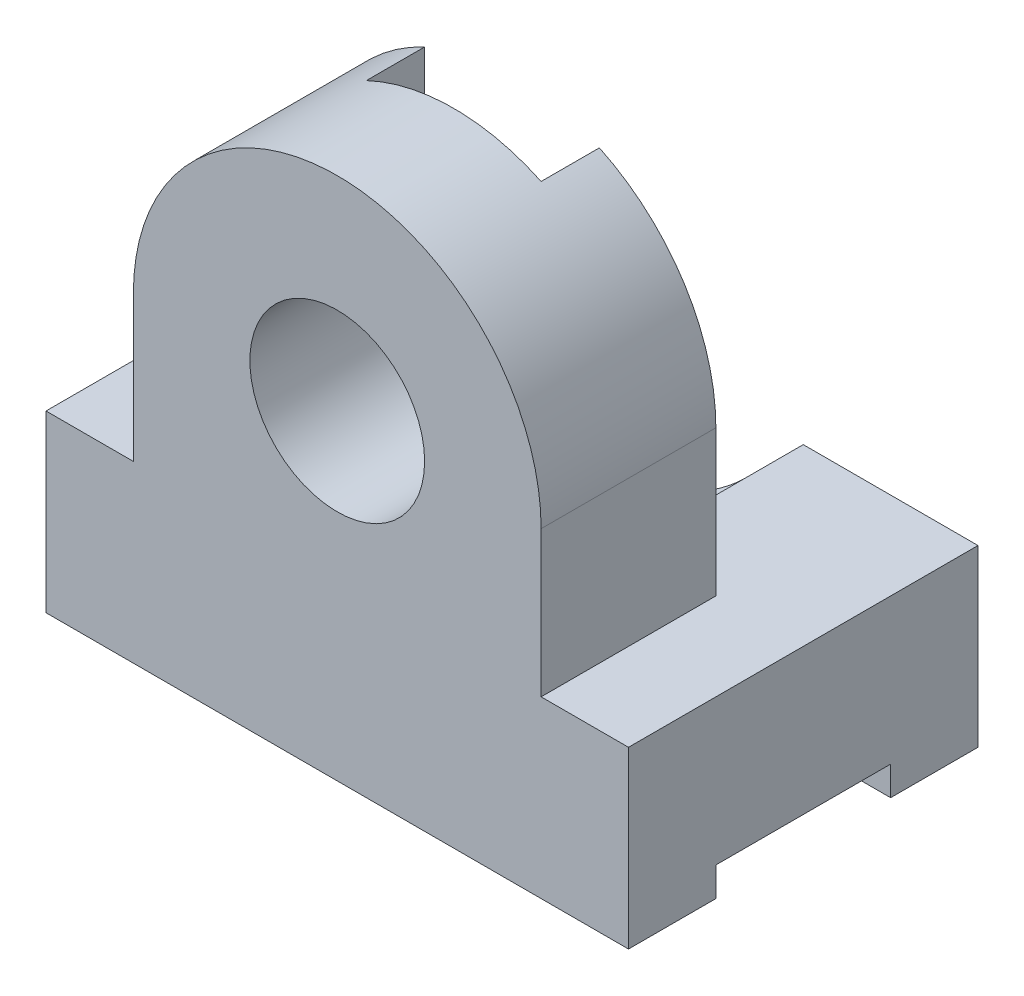
ISO-10303-21;
HEADER;
FILE_DESCRIPTION(('STEP AP214'),'2;1');
FILE_NAME('part.step','',(''),(''),'','','');
FILE_SCHEMA(('AUTOMOTIVE_DESIGN { 1 0 10303 214 1 1 1 1 }'));
ENDSEC;
DATA;
#1=APPLICATION_CONTEXT('core data for automotive mechanical design processes');
#2=APPLICATION_PROTOCOL_DEFINITION('international standard','automotive_design',2000,#1);
#3=PRODUCT_CONTEXT('',#1,'mechanical');
#4=PRODUCT('Part','Part','',(#3));
#5=PRODUCT_RELATED_PRODUCT_CATEGORY('part','',(#4));
#6=PRODUCT_DEFINITION_FORMATION('','',#4);
#7=PRODUCT_DEFINITION_CONTEXT('part definition',#1,'design');
#8=PRODUCT_DEFINITION('design','',#6,#7);
#9=PRODUCT_DEFINITION_SHAPE('','',#8);
#10=(LENGTH_UNIT() NAMED_UNIT(*) SI_UNIT(.MILLI.,.METRE.));
#11=(NAMED_UNIT(*) PLANE_ANGLE_UNIT() SI_UNIT($,.RADIAN.));
#12=(NAMED_UNIT(*) SI_UNIT($,.STERADIAN.) SOLID_ANGLE_UNIT());
#13=UNCERTAINTY_MEASURE_WITH_UNIT(LENGTH_MEASURE(1.E-05),#10,'distance_accuracy_value','');
#14=(GEOMETRIC_REPRESENTATION_CONTEXT(3) GLOBAL_UNCERTAINTY_ASSIGNED_CONTEXT((#13)) GLOBAL_UNIT_ASSIGNED_CONTEXT((#10,
#11,#12)) REPRESENTATION_CONTEXT('',''));
#15=CARTESIAN_POINT('',(0.,0.,0.));
#16=DIRECTION('',(0.,0.,1.));
#17=DIRECTION('',(1.,0.,0.));
#18=AXIS2_PLACEMENT_3D('',#15,#16,#17);
#19=CARTESIAN_POINT('',(0.,0.,-60.));
#20=DIRECTION('',(0.,0.,1.));
#21=DIRECTION('',(1.,0.,0.));
#22=AXIS2_PLACEMENT_3D('',#19,#20,#21);
#23=PLANE('',#22);
#24=DIRECTION('',(1.,0.,0.));
#25=VECTOR('',#24,1.);
#26=CARTESIAN_POINT('',(0.,-15.,-60.));
#27=LINE('',#26,#25);
#28=CARTESIAN_POINT('',(9.99999999999998,-15.,-60.));
#29=VERTEX_POINT('',#28);
#30=CARTESIAN_POINT('',(50.,-15.,-60.));
#31=VERTEX_POINT('',#30);
#32=EDGE_CURVE('E209',#29,#31,#27,.T.);
#33=ORIENTED_EDGE('',*,*,#32,.F.);
#34=DIRECTION('',(0.,1.,0.));
#35=VECTOR('',#34,1.);
#36=CARTESIAN_POINT('',(9.99999999999998,-15.,-60.));
#37=LINE('',#36,#35);
#38=CARTESIAN_POINT('',(9.99999999999998,5.,-60.));
#39=VERTEX_POINT('',#38);
#40=EDGE_CURVE('E195',#29,#39,#37,.T.);
#41=ORIENTED_EDGE('',*,*,#40,.T.);
#42=DIRECTION('',(1.,0.,0.));
#43=VECTOR('',#42,1.);
#44=CARTESIAN_POINT('',(0.,5.,-60.));
#45=LINE('',#44,#43);
#46=CARTESIAN_POINT('',(20.,5.,-60.));
#47=VERTEX_POINT('',#46);
#48=EDGE_CURVE('E351',#39,#47,#45,.T.);
#49=ORIENTED_EDGE('',*,*,#48,.T.);
#50=DIRECTION('',(0.,-1.,0.));
#51=VECTOR('',#50,1.);
#52=CARTESIAN_POINT('',(20.,0.,-60.));
#53=LINE('',#52,#51);
#54=CARTESIAN_POINT('',(20.,15.,-60.));
#55=VERTEX_POINT('',#54);
#56=EDGE_CURVE('E342',#55,#47,#53,.T.);
#57=ORIENTED_EDGE('',*,*,#56,.F.);
#58=DIRECTION('',(1.,0.,0.));
#59=VECTOR('',#58,1.);
#60=CARTESIAN_POINT('',(0.,15.,-60.));
#61=LINE('',#60,#59);
#62=CARTESIAN_POINT('',(50.,15.,-60.));
#63=VERTEX_POINT('',#62);
#64=EDGE_CURVE('E246',#55,#63,#61,.T.);
#65=ORIENTED_EDGE('',*,*,#64,.T.);
#66=DIRECTION('',(0.,1.,0.));
#67=VECTOR('',#66,1.);
#68=CARTESIAN_POINT('',(50.,0.,-60.));
#69=LINE('',#68,#67);
#70=EDGE_CURVE('E217',#31,#63,#69,.T.);
#71=ORIENTED_EDGE('',*,*,#70,.F.);
#72=EDGE_LOOP('',(#33,#41,#49,#57,#65,#71));
#73=FACE_BOUND('',#72,.T.);
#74=ADVANCED_FACE('F47',(#73),#23,.F.);
#75=CARTESIAN_POINT('',(0.,-15.,-60.));
#76=DIRECTION('',(0.,-1.,0.));
#77=DIRECTION('',(0.,0.,-1.));
#78=AXIS2_PLACEMENT_3D('',#75,#76,#77);
#79=PLANE('',#78);
#80=DIRECTION('',(-1.,0.,0.));
#81=VECTOR('',#80,1.);
#82=CARTESIAN_POINT('',(0.,-15.,-15.));
#83=LINE('',#82,#81);
#84=CARTESIAN_POINT('',(50.,-15.,-15.));
#85=VERTEX_POINT('',#84);
#86=CARTESIAN_POINT('',(-50.,-15.,-15.));
#87=VERTEX_POINT('',#86);
#88=EDGE_CURVE('E338',#85,#87,#83,.T.);
#89=ORIENTED_EDGE('',*,*,#88,.F.);
#90=DIRECTION('',(0.,0.,1.));
#91=VECTOR('',#90,1.);
#92=CARTESIAN_POINT('',(50.,-15.,-60.));
#93=LINE('',#92,#91);
#94=CARTESIAN_POINT('',(50.,-15.,0.));
#95=VERTEX_POINT('',#94);
#96=EDGE_CURVE('E255',#85,#95,#93,.T.);
#97=ORIENTED_EDGE('',*,*,#96,.T.);
#98=DIRECTION('',(1.,0.,0.));
#99=VECTOR('',#98,1.);
#100=CARTESIAN_POINT('',(0.,-15.,0.));
#101=LINE('',#100,#99);
#102=CARTESIAN_POINT('',(-50.,-15.,0.));
#103=VERTEX_POINT('',#102);
#104=EDGE_CURVE('E238',#103,#95,#101,.T.);
#105=ORIENTED_EDGE('',*,*,#104,.F.);
#106=DIRECTION('',(0.,0.,1.));
#107=VECTOR('',#106,1.);
#108=CARTESIAN_POINT('',(-50.,-15.,-60.));
#109=LINE('',#108,#107);
#110=EDGE_CURVE('E260',#87,#103,#109,.T.);
#111=ORIENTED_EDGE('',*,*,#110,.F.);
#112=EDGE_LOOP('',(#89,#97,#105,#111));
#113=FACE_BOUND('',#112,.T.);
#114=ADVANCED_FACE('F507',(#113),#79,.T.);
#115=CARTESIAN_POINT('',(0.,15.,-60.));
#116=DIRECTION('',(0.,-1.,0.));
#117=DIRECTION('',(0.,0.,-1.));
#118=AXIS2_PLACEMENT_3D('',#115,#116,#117);
#119=PLANE('',#118);
#120=DIRECTION('',(0.,0.,1.));
#121=VECTOR('',#120,1.);
#122=CARTESIAN_POINT('',(20.,15.,-60.));
#123=LINE('',#122,#121);
#124=CARTESIAN_POINT('',(20.,15.,-40.));
#125=VERTEX_POINT('',#124);
#126=EDGE_CURVE('E356',#55,#125,#123,.T.);
#127=ORIENTED_EDGE('',*,*,#126,.T.);
#128=DIRECTION('',(1.,0.,0.));
#129=VECTOR('',#128,1.);
#130=CARTESIAN_POINT('',(0.,15.,-40.));
#131=LINE('',#130,#129);
#132=CARTESIAN_POINT('',(-20.,15.,-40.));
#133=VERTEX_POINT('',#132);
#134=EDGE_CURVE('E360',#133,#125,#131,.T.);
#135=ORIENTED_EDGE('',*,*,#134,.F.);
#136=DIRECTION('',(0.,0.,1.));
#137=VECTOR('',#136,1.);
#138=CARTESIAN_POINT('',(-20.,15.,-60.));
#139=LINE('',#138,#137);
#140=CARTESIAN_POINT('',(-20.,15.,-60.));
#141=VERTEX_POINT('',#140);
#142=EDGE_CURVE('E377',#141,#133,#139,.T.);
#143=ORIENTED_EDGE('',*,*,#142,.F.);
#144=CARTESIAN_POINT('',(-50.,15.,-60.));
#145=VERTEX_POINT('',#144);
#146=EDGE_CURVE('E223',#145,#141,#61,.T.);
#147=ORIENTED_EDGE('',*,*,#146,.F.);
#148=DIRECTION('',(0.,0.,1.));
#149=VECTOR('',#148,1.);
#150=CARTESIAN_POINT('',(-50.,15.,-60.));
#151=LINE('',#150,#149);
#152=CARTESIAN_POINT('',(-50.,15.,0.));
#153=VERTEX_POINT('',#152);
#154=EDGE_CURVE('E229',#145,#153,#151,.T.);
#155=ORIENTED_EDGE('',*,*,#154,.T.);
#156=DIRECTION('',(1.,0.,0.));
#157=VECTOR('',#156,1.);
#158=CARTESIAN_POINT('',(0.,15.,0.));
#159=LINE('',#158,#157);
#160=CARTESIAN_POINT('',(-35.,15.,0.));
#161=VERTEX_POINT('',#160);
#162=EDGE_CURVE('E230',#153,#161,#159,.T.);
#163=ORIENTED_EDGE('',*,*,#162,.T.);
#164=DIRECTION('',(0.,0.,1.));
#165=VECTOR('',#164,1.);
#166=CARTESIAN_POINT('',(-35.,15.,-30.));
#167=LINE('',#166,#165);
#168=CARTESIAN_POINT('',(-35.,15.,-30.));
#169=VERTEX_POINT('',#168);
#170=EDGE_CURVE('E423',#169,#161,#167,.T.);
#171=ORIENTED_EDGE('',*,*,#170,.F.);
#172=DIRECTION('',(1.,0.,0.));
#173=VECTOR('',#172,1.);
#174=CARTESIAN_POINT('',(0.,15.,-30.));
#175=LINE('',#174,#173);
#176=CARTESIAN_POINT('',(35.,15.,-30.));
#177=VERTEX_POINT('',#176);
#178=EDGE_CURVE('E400',#169,#177,#175,.T.);
#179=ORIENTED_EDGE('',*,*,#178,.T.);
#180=DIRECTION('',(0.,0.,1.));
#181=VECTOR('',#180,1.);
#182=CARTESIAN_POINT('',(35.,15.,-30.));
#183=LINE('',#182,#181);
#184=CARTESIAN_POINT('',(35.,15.,0.));
#185=VERTEX_POINT('',#184);
#186=EDGE_CURVE('E419',#177,#185,#183,.T.);
#187=ORIENTED_EDGE('',*,*,#186,.T.);
#188=CARTESIAN_POINT('',(50.,15.,0.));
#189=VERTEX_POINT('',#188);
#190=EDGE_CURVE('E235',#185,#189,#159,.T.);
#191=ORIENTED_EDGE('',*,*,#190,.T.);
#192=DIRECTION('',(0.,0.,1.));
#193=VECTOR('',#192,1.);
#194=CARTESIAN_POINT('',(50.,15.,-60.));
#195=LINE('',#194,#193);
#196=EDGE_CURVE('E247',#63,#189,#195,.T.);
#197=ORIENTED_EDGE('',*,*,#196,.F.);
#198=ORIENTED_EDGE('',*,*,#64,.F.);
#199=EDGE_LOOP('',(#127,#135,#143,#147,#155,#163,#171,#179,#187,#191,#197,#198));
#200=FACE_BOUND('',#199,.T.);
#201=ADVANCED_FACE('F49',(#200),#119,.F.);
#202=CARTESIAN_POINT('',(-20.,5.,-60.));
#203=VERTEX_POINT('',#202);
#204=CARTESIAN_POINT('',(-10.,5.,-60.));
#205=VERTEX_POINT('',#204);
#206=EDGE_CURVE('E352',#203,#205,#45,.T.);
#207=ORIENTED_EDGE('',*,*,#206,.T.);
#208=DIRECTION('',(0.,1.,0.));
#209=VECTOR('',#208,1.);
#210=CARTESIAN_POINT('',(-10.,-15.,-60.));
#211=LINE('',#210,#209);
#212=CARTESIAN_POINT('',(-10.,-15.,-60.));
#213=VERTEX_POINT('',#212);
#214=EDGE_CURVE('E63',#205,#213,#211,.F.);
#215=ORIENTED_EDGE('',*,*,#214,.T.);
#216=CARTESIAN_POINT('',(-50.,-15.,-60.));
#217=VERTEX_POINT('',#216);
#218=EDGE_CURVE('E212',#217,#213,#27,.T.);
#219=ORIENTED_EDGE('',*,*,#218,.F.);
#220=DIRECTION('',(0.,1.,0.));
#221=VECTOR('',#220,1.);
#222=CARTESIAN_POINT('',(-50.,0.,-60.));
#223=LINE('',#222,#221);
#224=EDGE_CURVE('E219',#217,#145,#223,.T.);
#225=ORIENTED_EDGE('',*,*,#224,.T.);
#226=ORIENTED_EDGE('',*,*,#146,.T.);
#227=DIRECTION('',(0.,-1.,0.));
#228=VECTOR('',#227,1.);
#229=CARTESIAN_POINT('',(-20.,0.,-60.));
#230=LINE('',#229,#228);
#231=EDGE_CURVE('E346',#141,#203,#230,.T.);
#232=ORIENTED_EDGE('',*,*,#231,.T.);
#233=EDGE_LOOP('',(#207,#215,#219,#225,#226,#232));
#234=FACE_BOUND('',#233,.T.);
#235=ADVANCED_FACE('F452',(#234),#23,.F.);
#236=CARTESIAN_POINT('',(50.,0.,-60.));
#237=DIRECTION('',(1.,0.,0.));
#238=DIRECTION('',(0.,0.,-1.));
#239=AXIS2_PLACEMENT_3D('',#236,#237,#238);
#240=PLANE('',#239);
#241=DIRECTION('',(0.,-1.,0.));
#242=VECTOR('',#241,1.);
#243=CARTESIAN_POINT('',(50.,-20.,-15.));
#244=LINE('',#243,#242);
#245=CARTESIAN_POINT('',(50.,-10.,-15.));
#246=VERTEX_POINT('',#245);
#247=EDGE_CURVE('E310',#246,#85,#244,.T.);
#248=ORIENTED_EDGE('',*,*,#247,.F.);
#249=DIRECTION('',(0.,0.,1.));
#250=VECTOR('',#249,1.);
#251=CARTESIAN_POINT('',(50.,-10.,-15.));
#252=LINE('',#251,#250);
#253=CARTESIAN_POINT('',(50.,-9.99999999999999,-45.));
#254=VERTEX_POINT('',#253);
#255=EDGE_CURVE('E316',#254,#246,#252,.T.);
#256=ORIENTED_EDGE('',*,*,#255,.F.);
#257=DIRECTION('',(0.,1.,0.));
#258=VECTOR('',#257,1.);
#259=CARTESIAN_POINT('',(50.,-20.,-45.));
#260=LINE('',#259,#258);
#261=CARTESIAN_POINT('',(50.,-15.,-45.));
#262=VERTEX_POINT('',#261);
#263=EDGE_CURVE('E323',#262,#254,#260,.T.);
#264=ORIENTED_EDGE('',*,*,#263,.F.);
#265=EDGE_CURVE('E252',#31,#262,#93,.T.);
#266=ORIENTED_EDGE('',*,*,#265,.F.);
#267=ORIENTED_EDGE('',*,*,#70,.T.);
#268=ORIENTED_EDGE('',*,*,#196,.T.);
#269=DIRECTION('',(0.,1.,0.));
#270=VECTOR('',#269,1.);
#271=CARTESIAN_POINT('',(50.,0.,0.));
#272=LINE('',#271,#270);
#273=EDGE_CURVE('E242',#95,#189,#272,.T.);
#274=ORIENTED_EDGE('',*,*,#273,.F.);
#275=ORIENTED_EDGE('',*,*,#96,.F.);
#276=EDGE_LOOP('',(#248,#256,#264,#266,#267,#268,#274,#275));
#277=FACE_BOUND('',#276,.T.);
#278=ADVANCED_FACE('F443',(#277),#240,.T.);
#279=CARTESIAN_POINT('',(0.,-15.,-60.));
#280=DIRECTION('',(0.,1.,0.));
#281=DIRECTION('',(0.,0.,1.));
#282=AXIS2_PLACEMENT_3D('',#279,#280,#281);
#283=CIRCLE('',#282,10.);
#284=EDGE_CURVE('E198',#213,#29,#283,.T.);
#285=ORIENTED_EDGE('',*,*,#284,.T.);
#286=ORIENTED_EDGE('',*,*,#32,.T.);
#287=ORIENTED_EDGE('',*,*,#265,.T.);
#288=DIRECTION('',(1.,0.,0.));
#289=VECTOR('',#288,1.);
#290=CARTESIAN_POINT('',(0.,-15.,-45.));
#291=LINE('',#290,#289);
#292=CARTESIAN_POINT('',(-50.,-15.,-45.));
#293=VERTEX_POINT('',#292);
#294=EDGE_CURVE('E332',#293,#262,#291,.T.);
#295=ORIENTED_EDGE('',*,*,#294,.F.);
#296=EDGE_CURVE('E256',#217,#293,#109,.T.);
#297=ORIENTED_EDGE('',*,*,#296,.F.);
#298=ORIENTED_EDGE('',*,*,#218,.T.);
#299=EDGE_LOOP('',(#285,#286,#287,#295,#297,#298));
#300=FACE_BOUND('',#299,.T.);
#301=ADVANCED_FACE('F207',(#300),#79,.T.);
#302=CARTESIAN_POINT('',(-50.,0.,-60.));
#303=DIRECTION('',(1.,0.,0.));
#304=DIRECTION('',(0.,0.,-1.));
#305=AXIS2_PLACEMENT_3D('',#302,#303,#304);
#306=PLANE('',#305);
#307=DIRECTION('',(0.,0.,1.));
#308=VECTOR('',#307,1.);
#309=CARTESIAN_POINT('',(-50.,-10.,-15.));
#310=LINE('',#309,#308);
#311=CARTESIAN_POINT('',(-50.,-9.99999999999999,-45.));
#312=VERTEX_POINT('',#311);
#313=CARTESIAN_POINT('',(-50.,-10.,-15.));
#314=VERTEX_POINT('',#313);
#315=EDGE_CURVE('E315',#312,#314,#310,.T.);
#316=ORIENTED_EDGE('',*,*,#315,.T.);
#317=DIRECTION('',(0.,-1.,0.));
#318=VECTOR('',#317,1.);
#319=CARTESIAN_POINT('',(-50.,-20.,-15.));
#320=LINE('',#319,#318);
#321=EDGE_CURVE('E311',#314,#87,#320,.T.);
#322=ORIENTED_EDGE('',*,*,#321,.T.);
#323=ORIENTED_EDGE('',*,*,#110,.T.);
#324=DIRECTION('',(0.,1.,0.));
#325=VECTOR('',#324,1.);
#326=CARTESIAN_POINT('',(-50.,0.,0.));
#327=LINE('',#326,#325);
#328=EDGE_CURVE('E234',#103,#153,#327,.T.);
#329=ORIENTED_EDGE('',*,*,#328,.T.);
#330=ORIENTED_EDGE('',*,*,#154,.F.);
#331=ORIENTED_EDGE('',*,*,#224,.F.);
#332=ORIENTED_EDGE('',*,*,#296,.T.);
#333=DIRECTION('',(0.,1.,0.));
#334=VECTOR('',#333,1.);
#335=CARTESIAN_POINT('',(-50.,0.,-45.));
#336=LINE('',#335,#334);
#337=EDGE_CURVE('E251',#293,#312,#336,.T.);
#338=ORIENTED_EDGE('',*,*,#337,.T.);
#339=EDGE_LOOP('',(#316,#322,#323,#329,#330,#331,#332,#338));
#340=FACE_BOUND('',#339,.T.);
#341=ADVANCED_FACE('F450',(#340),#306,.F.);
#342=CARTESIAN_POINT('',(0.,0.,0.));
#343=DIRECTION('',(0.,0.,1.));
#344=DIRECTION('',(1.,0.,0.));
#345=AXIS2_PLACEMENT_3D('',#342,#343,#344);
#346=PLANE('',#345);
#347=ORIENTED_EDGE('',*,*,#162,.F.);
#348=ORIENTED_EDGE('',*,*,#328,.F.);
#349=ORIENTED_EDGE('',*,*,#104,.T.);
#350=ORIENTED_EDGE('',*,*,#273,.T.);
#351=ORIENTED_EDGE('',*,*,#190,.F.);
#352=DIRECTION('',(0.,1.,0.));
#353=VECTOR('',#352,1.);
#354=CARTESIAN_POINT('',(35.,0.,0.));
#355=LINE('',#354,#353);
#356=CARTESIAN_POINT('',(35.,40.,0.));
#357=VERTEX_POINT('',#356);
#358=EDGE_CURVE('E408',#185,#357,#355,.T.);
#359=ORIENTED_EDGE('',*,*,#358,.T.);
#360=CARTESIAN_POINT('',(0.,40.,0.));
#361=DIRECTION('',(0.,0.,1.));
#362=DIRECTION('',(1.,0.,0.));
#363=AXIS2_PLACEMENT_3D('',#360,#361,#362);
#364=CIRCLE('',#363,35.);
#365=CARTESIAN_POINT('',(-35.0000000000001,39.9999999999998,0.));
#366=VERTEX_POINT('',#365);
#367=EDGE_CURVE('E412',#357,#366,#364,.T.);
#368=ORIENTED_EDGE('',*,*,#367,.T.);
#369=DIRECTION('',(0.,1.,0.));
#370=VECTOR('',#369,1.);
#371=CARTESIAN_POINT('',(-35.,0.,0.));
#372=LINE('',#371,#370);
#373=EDGE_CURVE('E388',#161,#366,#372,.T.);
#374=ORIENTED_EDGE('',*,*,#373,.F.);
#375=EDGE_LOOP('',(#347,#348,#349,#350,#351,#359,#368,#374));
#376=FACE_BOUND('',#375,.T.);
#377=CARTESIAN_POINT('',(0.,40.,0.));
#378=DIRECTION('',(0.,0.,1.));
#379=DIRECTION('',(1.,0.,0.));
#380=AXIS2_PLACEMENT_3D('',#377,#378,#379);
#381=CIRCLE('',#380,15.);
#382=CARTESIAN_POINT('',(15.,40.,0.));
#383=VERTEX_POINT('',#382);
#384=EDGE_CURVE('E373',#383,#383,#381,.T.);
#385=ORIENTED_EDGE('',*,*,#384,.F.);
#386=EDGE_LOOP('',(#385));
#387=FACE_BOUND('',#386,.T.);
#388=ADVANCED_FACE('F475',(#376,#387),#346,.T.);
#389=CARTESIAN_POINT('',(35.,0.,-30.));
#390=DIRECTION('',(1.,0.,0.));
#391=DIRECTION('',(0.,1.,0.));
#392=AXIS2_PLACEMENT_3D('',#389,#390,#391);
#393=PLANE('',#392);
#394=ORIENTED_EDGE('',*,*,#358,.F.);
#395=ORIENTED_EDGE('',*,*,#186,.F.);
#396=DIRECTION('',(0.,1.,0.));
#397=VECTOR('',#396,1.);
#398=CARTESIAN_POINT('',(35.,0.,-30.));
#399=LINE('',#398,#397);
#400=CARTESIAN_POINT('',(35.,40.,-30.));
#401=VERTEX_POINT('',#400);
#402=EDGE_CURVE('E387',#177,#401,#399,.T.);
#403=ORIENTED_EDGE('',*,*,#402,.T.);
#404=DIRECTION('',(0.,0.,1.));
#405=VECTOR('',#404,1.);
#406=CARTESIAN_POINT('',(35.,40.,-30.));
#407=LINE('',#406,#405);
#408=EDGE_CURVE('E404',#401,#357,#407,.T.);
#409=ORIENTED_EDGE('',*,*,#408,.T.);
#410=EDGE_LOOP('',(#394,#395,#403,#409));
#411=FACE_BOUND('',#410,.T.);
#412=ADVANCED_FACE('F488',(#411),#393,.T.);
#413=CARTESIAN_POINT('',(-35.,0.,-30.));
#414=DIRECTION('',(1.,0.,0.));
#415=DIRECTION('',(0.,1.,0.));
#416=AXIS2_PLACEMENT_3D('',#413,#414,#415);
#417=PLANE('',#416);
#418=ORIENTED_EDGE('',*,*,#373,.T.);
#419=DIRECTION('',(0.,0.,1.));
#420=VECTOR('',#419,1.);
#421=CARTESIAN_POINT('',(-35.0000000000001,39.9999999999998,-30.));
#422=LINE('',#421,#420);
#423=CARTESIAN_POINT('',(-35.0000000000001,39.9999999999998,-30.));
#424=VERTEX_POINT('',#423);
#425=EDGE_CURVE('E426',#424,#366,#422,.T.);
#426=ORIENTED_EDGE('',*,*,#425,.F.);
#427=DIRECTION('',(0.,1.,0.));
#428=VECTOR('',#427,1.);
#429=CARTESIAN_POINT('',(-35.,0.,-30.));
#430=LINE('',#429,#428);
#431=EDGE_CURVE('E396',#169,#424,#430,.T.);
#432=ORIENTED_EDGE('',*,*,#431,.F.);
#433=ORIENTED_EDGE('',*,*,#170,.T.);
#434=EDGE_LOOP('',(#418,#426,#432,#433));
#435=FACE_BOUND('',#434,.T.);
#436=ADVANCED_FACE('F481',(#435),#417,.F.);
#437=CARTESIAN_POINT('',(0.,40.,-30.));
#438=DIRECTION('',(0.,0.,1.));
#439=DIRECTION('',(1.,0.,0.));
#440=AXIS2_PLACEMENT_3D('',#437,#438,#439);
#441=CYLINDRICAL_SURFACE('',#440,15.);
#442=DIRECTION('',(0.,0.,-1.));
#443=VECTOR('',#442,1.);
#444=CARTESIAN_POINT('',(-15.,40.,-20.));
#445=LINE('',#444,#443);
#446=CARTESIAN_POINT('',(-15.,40.,-20.));
#447=VERTEX_POINT('',#446);
#448=CARTESIAN_POINT('',(-15.,40.,-30.));
#449=VERTEX_POINT('',#448);
#450=EDGE_CURVE('E70',#447,#449,#445,.T.);
#451=ORIENTED_EDGE('',*,*,#450,.F.);
#452=CARTESIAN_POINT('',(0.,40.,-20.));
#453=DIRECTION('',(0.,0.,-1.));
#454=DIRECTION('',(-1.,0.,0.));
#455=AXIS2_PLACEMENT_3D('',#452,#453,#454);
#456=CIRCLE('',#455,15.);
#457=CARTESIAN_POINT('',(15.,40.,-20.));
#458=VERTEX_POINT('',#457);
#459=EDGE_CURVE('E307',#458,#447,#456,.F.);
#460=ORIENTED_EDGE('',*,*,#459,.F.);
#461=DIRECTION('',(0.,0.,-1.));
#462=VECTOR('',#461,1.);
#463=CARTESIAN_POINT('',(15.,40.,-20.));
#464=LINE('',#463,#462);
#465=CARTESIAN_POINT('',(15.,40.,-30.));
#466=VERTEX_POINT('',#465);
#467=EDGE_CURVE('E290',#458,#466,#464,.T.);
#468=ORIENTED_EDGE('',*,*,#467,.T.);
#469=CARTESIAN_POINT('',(0.,40.,-30.));
#470=DIRECTION('',(0.,0.,1.));
#471=DIRECTION('',(1.,0.,0.));
#472=AXIS2_PLACEMENT_3D('',#469,#470,#471);
#473=CIRCLE('',#472,15.);
#474=EDGE_CURVE('E383',#449,#466,#473,.T.);
#475=ORIENTED_EDGE('',*,*,#474,.F.);
#476=EDGE_LOOP('',(#451,#460,#468,#475));
#477=FACE_BOUND('',#476,.T.);
#478=ORIENTED_EDGE('',*,*,#384,.T.);
#479=EDGE_LOOP('',(#478));
#480=FACE_BOUND('',#479,.T.);
#481=ADVANCED_FACE('F494',(#477,#480),#441,.F.);
#482=CARTESIAN_POINT('',(0.,40.,-30.));
#483=DIRECTION('',(0.,0.,1.));
#484=DIRECTION('',(1.,0.,0.));
#485=AXIS2_PLACEMENT_3D('',#482,#483,#484);
#486=CYLINDRICAL_SURFACE('',#485,35.);
#487=DIRECTION('',(0.,0.,1.));
#488=VECTOR('',#487,1.);
#489=CARTESIAN_POINT('',(15.,71.6227766016838,-30.));
#490=LINE('',#489,#488);
#491=CARTESIAN_POINT('',(15.,71.6227766016838,-20.));
#492=VERTEX_POINT('',#491);
#493=CARTESIAN_POINT('',(15.,71.6227766016838,-30.));
#494=VERTEX_POINT('',#493);
#495=EDGE_CURVE('E279',#492,#494,#490,.F.);
#496=ORIENTED_EDGE('',*,*,#495,.F.);
#497=CARTESIAN_POINT('',(0.,40.,-20.));
#498=DIRECTION('',(0.,0.,-1.));
#499=DIRECTION('',(-1.,0.,0.));
#500=AXIS2_PLACEMENT_3D('',#497,#498,#499);
#501=CIRCLE('',#500,35.);
#502=CARTESIAN_POINT('',(-15.,71.6227766016838,-20.));
#503=VERTEX_POINT('',#502);
#504=EDGE_CURVE('E56',#492,#503,#501,.F.);
#505=ORIENTED_EDGE('',*,*,#504,.T.);
#506=DIRECTION('',(0.,0.,1.));
#507=VECTOR('',#506,1.);
#508=CARTESIAN_POINT('',(-15.,71.6227766016838,-30.));
#509=LINE('',#508,#507);
#510=CARTESIAN_POINT('',(-15.,71.6227766016838,-30.));
#511=VERTEX_POINT('',#510);
#512=EDGE_CURVE('E276',#511,#503,#509,.T.);
#513=ORIENTED_EDGE('',*,*,#512,.F.);
#514=CARTESIAN_POINT('',(0.,40.,-30.));
#515=DIRECTION('',(0.,0.,1.));
#516=DIRECTION('',(1.,0.,0.));
#517=AXIS2_PLACEMENT_3D('',#514,#515,#516);
#518=CIRCLE('',#517,35.);
#519=EDGE_CURVE('E392',#511,#424,#518,.T.);
#520=ORIENTED_EDGE('',*,*,#519,.T.);
#521=ORIENTED_EDGE('',*,*,#425,.T.);
#522=ORIENTED_EDGE('',*,*,#367,.F.);
#523=ORIENTED_EDGE('',*,*,#408,.F.);
#524=EDGE_CURVE('E393',#401,#494,#518,.T.);
#525=ORIENTED_EDGE('',*,*,#524,.T.);
#526=EDGE_LOOP('',(#496,#505,#513,#520,#521,#522,#523,#525));
#527=FACE_BOUND('',#526,.T.);
#528=ADVANCED_FACE('F275',(#527),#486,.T.);
#529=CARTESIAN_POINT('',(0.,0.,-30.));
#530=DIRECTION('',(0.,0.,1.));
#531=DIRECTION('',(1.,0.,0.));
#532=AXIS2_PLACEMENT_3D('',#529,#530,#531);
#533=PLANE('',#532);
#534=ORIENTED_EDGE('',*,*,#474,.T.);
#535=DIRECTION('',(0.,1.,0.));
#536=VECTOR('',#535,1.);
#537=CARTESIAN_POINT('',(15.,0.,-30.));
#538=LINE('',#537,#536);
#539=EDGE_CURVE('E267',#466,#494,#538,.T.);
#540=ORIENTED_EDGE('',*,*,#539,.T.);
#541=ORIENTED_EDGE('',*,*,#524,.F.);
#542=ORIENTED_EDGE('',*,*,#402,.F.);
#543=ORIENTED_EDGE('',*,*,#178,.F.);
#544=ORIENTED_EDGE('',*,*,#431,.T.);
#545=ORIENTED_EDGE('',*,*,#519,.F.);
#546=DIRECTION('',(0.,1.,0.));
#547=VECTOR('',#546,1.);
#548=CARTESIAN_POINT('',(-15.,40.,-30.));
#549=LINE('',#548,#547);
#550=EDGE_CURVE('E203',#449,#511,#549,.T.);
#551=ORIENTED_EDGE('',*,*,#550,.F.);
#552=EDGE_LOOP('',(#534,#540,#541,#542,#543,#544,#545,#551));
#553=FACE_BOUND('',#552,.T.);
#554=ADVANCED_FACE('F485',(#553),#533,.F.);
#555=CARTESIAN_POINT('',(20.,0.,-60.));
#556=DIRECTION('',(-1.,0.,0.));
#557=DIRECTION('',(0.,-1.,0.));
#558=AXIS2_PLACEMENT_3D('',#555,#556,#557);
#559=PLANE('',#558);
#560=DIRECTION('',(0.,-1.,0.));
#561=VECTOR('',#560,1.);
#562=CARTESIAN_POINT('',(20.,0.,-40.));
#563=LINE('',#562,#561);
#564=CARTESIAN_POINT('',(20.,5.,-40.));
#565=VERTEX_POINT('',#564);
#566=EDGE_CURVE('E341',#125,#565,#563,.T.);
#567=ORIENTED_EDGE('',*,*,#566,.F.);
#568=ORIENTED_EDGE('',*,*,#126,.F.);
#569=ORIENTED_EDGE('',*,*,#56,.T.);
#570=DIRECTION('',(0.,0.,1.));
#571=VECTOR('',#570,1.);
#572=CARTESIAN_POINT('',(20.,5.,-60.));
#573=LINE('',#572,#571);
#574=EDGE_CURVE('E370',#47,#565,#573,.T.);
#575=ORIENTED_EDGE('',*,*,#574,.T.);
#576=EDGE_LOOP('',(#567,#568,#569,#575));
#577=FACE_BOUND('',#576,.T.);
#578=ADVANCED_FACE('F469',(#577),#559,.T.);
#579=CARTESIAN_POINT('',(0.,5.,-60.));
#580=DIRECTION('',(0.,-1.,0.));
#581=DIRECTION('',(0.,0.,-1.));
#582=AXIS2_PLACEMENT_3D('',#579,#580,#581);
#583=PLANE('',#582);
#584=ORIENTED_EDGE('',*,*,#48,.F.);
#585=CARTESIAN_POINT('',(0.,5.,-60.));
#586=DIRECTION('',(0.,-1.,0.));
#587=DIRECTION('',(0.,0.,-1.));
#588=AXIS2_PLACEMENT_3D('',#585,#586,#587);
#589=CIRCLE('',#588,10.);
#590=EDGE_CURVE('E11',#39,#205,#589,.T.);
#591=ORIENTED_EDGE('',*,*,#590,.T.);
#592=ORIENTED_EDGE('',*,*,#206,.F.);
#593=DIRECTION('',(0.,0.,1.));
#594=VECTOR('',#593,1.);
#595=CARTESIAN_POINT('',(-20.,5.,-60.));
#596=LINE('',#595,#594);
#597=CARTESIAN_POINT('',(-20.,5.,-40.));
#598=VERTEX_POINT('',#597);
#599=EDGE_CURVE('E374',#203,#598,#596,.T.);
#600=ORIENTED_EDGE('',*,*,#599,.T.);
#601=DIRECTION('',(1.,0.,0.));
#602=VECTOR('',#601,1.);
#603=CARTESIAN_POINT('',(0.,5.,-40.));
#604=LINE('',#603,#602);
#605=EDGE_CURVE('E347',#598,#565,#604,.T.);
#606=ORIENTED_EDGE('',*,*,#605,.T.);
#607=ORIENTED_EDGE('',*,*,#574,.F.);
#608=EDGE_LOOP('',(#584,#591,#592,#600,#606,#607));
#609=FACE_BOUND('',#608,.T.);
#610=ADVANCED_FACE('F457',(#609),#583,.F.);
#611=CARTESIAN_POINT('',(-20.,0.,-60.));
#612=DIRECTION('',(-1.,0.,0.));
#613=DIRECTION('',(0.,-1.,0.));
#614=AXIS2_PLACEMENT_3D('',#611,#612,#613);
#615=PLANE('',#614);
#616=DIRECTION('',(0.,-1.,0.));
#617=VECTOR('',#616,1.);
#618=CARTESIAN_POINT('',(-20.,0.,-40.));
#619=LINE('',#618,#617);
#620=EDGE_CURVE('E363',#133,#598,#619,.T.);
#621=ORIENTED_EDGE('',*,*,#620,.T.);
#622=ORIENTED_EDGE('',*,*,#599,.F.);
#623=ORIENTED_EDGE('',*,*,#231,.F.);
#624=ORIENTED_EDGE('',*,*,#142,.T.);
#625=EDGE_LOOP('',(#621,#622,#623,#624));
#626=FACE_BOUND('',#625,.T.);
#627=ADVANCED_FACE('F459',(#626),#615,.F.);
#628=CARTESIAN_POINT('',(0.,0.,-40.));
#629=DIRECTION('',(0.,0.,1.));
#630=DIRECTION('',(1.,0.,0.));
#631=AXIS2_PLACEMENT_3D('',#628,#629,#630);
#632=PLANE('',#631);
#633=ORIENTED_EDGE('',*,*,#566,.T.);
#634=ORIENTED_EDGE('',*,*,#605,.F.);
#635=ORIENTED_EDGE('',*,*,#620,.F.);
#636=ORIENTED_EDGE('',*,*,#134,.T.);
#637=EDGE_LOOP('',(#633,#634,#635,#636));
#638=FACE_BOUND('',#637,.T.);
#639=ADVANCED_FACE('F465',(#638),#632,.F.);
#640=CARTESIAN_POINT('',(-50.,-20.,-15.));
#641=DIRECTION('',(0.,0.,1.));
#642=DIRECTION('',(0.,-1.,0.));
#643=AXIS2_PLACEMENT_3D('',#640,#641,#642);
#644=PLANE('',#643);
#645=ORIENTED_EDGE('',*,*,#88,.T.);
#646=ORIENTED_EDGE('',*,*,#321,.F.);
#647=DIRECTION('',(1.,0.,0.));
#648=VECTOR('',#647,1.);
#649=CARTESIAN_POINT('',(-50.,-10.,-15.));
#650=LINE('',#649,#648);
#651=EDGE_CURVE('E329',#314,#246,#650,.T.);
#652=ORIENTED_EDGE('',*,*,#651,.T.);
#653=ORIENTED_EDGE('',*,*,#247,.T.);
#654=EDGE_LOOP('',(#645,#646,#652,#653));
#655=FACE_BOUND('',#654,.T.);
#656=ADVANCED_FACE('F550',(#655),#644,.F.);
#657=CARTESIAN_POINT('',(-50.,-10.,-15.));
#658=DIRECTION('',(0.,1.,0.));
#659=DIRECTION('',(0.,0.,1.));
#660=AXIS2_PLACEMENT_3D('',#657,#658,#659);
#661=PLANE('',#660);
#662=ORIENTED_EDGE('',*,*,#255,.T.);
#663=ORIENTED_EDGE('',*,*,#651,.F.);
#664=ORIENTED_EDGE('',*,*,#315,.F.);
#665=DIRECTION('',(1.,0.,0.));
#666=VECTOR('',#665,1.);
#667=CARTESIAN_POINT('',(-50.,-9.99999999999999,-45.));
#668=LINE('',#667,#666);
#669=EDGE_CURVE('E320',#312,#254,#668,.T.);
#670=ORIENTED_EDGE('',*,*,#669,.T.);
#671=EDGE_LOOP('',(#662,#663,#664,#670));
#672=FACE_BOUND('',#671,.T.);
#673=ADVANCED_FACE('F577',(#672),#661,.F.);
#674=CARTESIAN_POINT('',(-50.,-20.,-45.));
#675=DIRECTION('',(0.,0.,-1.));
#676=DIRECTION('',(0.,1.,0.));
#677=AXIS2_PLACEMENT_3D('',#674,#675,#676);
#678=PLANE('',#677);
#679=ORIENTED_EDGE('',*,*,#294,.T.);
#680=ORIENTED_EDGE('',*,*,#263,.T.);
#681=ORIENTED_EDGE('',*,*,#669,.F.);
#682=ORIENTED_EDGE('',*,*,#337,.F.);
#683=EDGE_LOOP('',(#679,#680,#681,#682));
#684=FACE_BOUND('',#683,.T.);
#685=ADVANCED_FACE('F585',(#684),#678,.F.);
#686=CARTESIAN_POINT('',(0.,40.,-20.));
#687=DIRECTION('',(0.,0.,-1.));
#688=DIRECTION('',(-1.,0.,0.));
#689=AXIS2_PLACEMENT_3D('',#686,#687,#688);
#690=PLANE('',#689);
#691=ORIENTED_EDGE('',*,*,#459,.T.);
#692=DIRECTION('',(0.,1.,0.));
#693=VECTOR('',#692,1.);
#694=CARTESIAN_POINT('',(-15.,40.,-20.));
#695=LINE('',#694,#693);
#696=EDGE_CURVE('E286',#447,#503,#695,.T.);
#697=ORIENTED_EDGE('',*,*,#696,.T.);
#698=ORIENTED_EDGE('',*,*,#504,.F.);
#699=DIRECTION('',(0.,-1.,0.));
#700=VECTOR('',#699,1.);
#701=CARTESIAN_POINT('',(15.,40.,-20.));
#702=LINE('',#701,#700);
#703=EDGE_CURVE('E284',#492,#458,#702,.T.);
#704=ORIENTED_EDGE('',*,*,#703,.T.);
#705=EDGE_LOOP('',(#691,#697,#698,#704));
#706=FACE_BOUND('',#705,.T.);
#707=ADVANCED_FACE('F283',(#706),#690,.T.);
#708=CARTESIAN_POINT('',(15.,40.,-20.));
#709=DIRECTION('',(1.,0.,0.));
#710=DIRECTION('',(0.,0.,-1.));
#711=AXIS2_PLACEMENT_3D('',#708,#709,#710);
#712=PLANE('',#711);
#713=ORIENTED_EDGE('',*,*,#495,.T.);
#714=ORIENTED_EDGE('',*,*,#539,.F.);
#715=ORIENTED_EDGE('',*,*,#467,.F.);
#716=ORIENTED_EDGE('',*,*,#703,.F.);
#717=EDGE_LOOP('',(#713,#714,#715,#716));
#718=FACE_BOUND('',#717,.T.);
#719=ADVANCED_FACE('F288',(#718),#712,.F.);
#720=CARTESIAN_POINT('',(-15.,40.,-20.));
#721=DIRECTION('',(-1.,0.,0.));
#722=DIRECTION('',(0.,0.,1.));
#723=AXIS2_PLACEMENT_3D('',#720,#721,#722);
#724=PLANE('',#723);
#725=ORIENTED_EDGE('',*,*,#512,.T.);
#726=ORIENTED_EDGE('',*,*,#696,.F.);
#727=ORIENTED_EDGE('',*,*,#450,.T.);
#728=ORIENTED_EDGE('',*,*,#550,.T.);
#729=EDGE_LOOP('',(#725,#726,#727,#728));
#730=FACE_BOUND('',#729,.T.);
#731=ADVANCED_FACE('F496',(#730),#724,.F.);
#732=CARTESIAN_POINT('',(0.,-15.,-60.));
#733=DIRECTION('',(0.,1.,0.));
#734=DIRECTION('',(0.,0.,1.));
#735=AXIS2_PLACEMENT_3D('',#732,#733,#734);
#736=CYLINDRICAL_SURFACE('',#735,10.);
#737=ORIENTED_EDGE('',*,*,#284,.F.);
#738=ORIENTED_EDGE('',*,*,#214,.F.);
#739=ORIENTED_EDGE('',*,*,#590,.F.);
#740=ORIENTED_EDGE('',*,*,#40,.F.);
#741=EDGE_LOOP('',(#737,#738,#739,#740));
#742=FACE_BOUND('',#741,.T.);
#743=ADVANCED_FACE('F197',(#742),#736,.F.);
#744=CLOSED_SHELL('',(#74,#114,#201,#235,#278,#301,#341,#388,#412,#436,#481,#528,#554,#578,#610,
#627,#639,#656,#673,#685,#707,#719,#731,#743));
#745=MANIFOLD_SOLID_BREP('B2',#744);
#746=ADVANCED_BREP_SHAPE_REPRESENTATION('',(#18,#745),#14);
#747=SHAPE_DEFINITION_REPRESENTATION(#9,#746);
ENDSEC;
END-ISO-10303-21;
